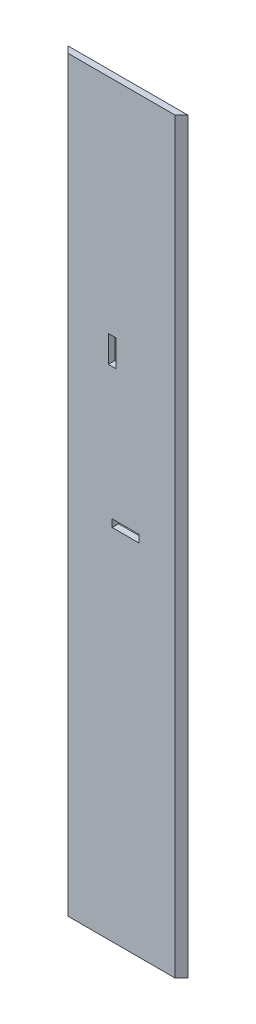
ISO-10303-21;
HEADER;
FILE_DESCRIPTION(('STEP AP214'),'2;1');
FILE_NAME('part.step','',(''),(''),'','','');
FILE_SCHEMA(('AUTOMOTIVE_DESIGN { 1 0 10303 214 1 1 1 1 }'));
ENDSEC;
DATA;
#1=APPLICATION_CONTEXT('core data for automotive mechanical design processes');
#2=APPLICATION_PROTOCOL_DEFINITION('international standard','automotive_design',2000,#1);
#3=PRODUCT_CONTEXT('',#1,'mechanical');
#4=PRODUCT('Part','Part','',(#3));
#5=PRODUCT_RELATED_PRODUCT_CATEGORY('part','',(#4));
#6=PRODUCT_DEFINITION_FORMATION('','',#4);
#7=PRODUCT_DEFINITION_CONTEXT('part definition',#1,'design');
#8=PRODUCT_DEFINITION('design','',#6,#7);
#9=PRODUCT_DEFINITION_SHAPE('','',#8);
#10=(LENGTH_UNIT() NAMED_UNIT(*) SI_UNIT(.MILLI.,.METRE.));
#11=(NAMED_UNIT(*) PLANE_ANGLE_UNIT() SI_UNIT($,.RADIAN.));
#12=(NAMED_UNIT(*) SI_UNIT($,.STERADIAN.) SOLID_ANGLE_UNIT());
#13=UNCERTAINTY_MEASURE_WITH_UNIT(LENGTH_MEASURE(1.E-05),#10,'distance_accuracy_value','');
#14=(GEOMETRIC_REPRESENTATION_CONTEXT(3) GLOBAL_UNCERTAINTY_ASSIGNED_CONTEXT((#13)) GLOBAL_UNIT_ASSIGNED_CONTEXT((#10,
#11,#12)) REPRESENTATION_CONTEXT('',''));
#15=CARTESIAN_POINT('',(0.,0.,0.));
#16=DIRECTION('',(0.,0.,1.));
#17=DIRECTION('',(1.,0.,0.));
#18=AXIS2_PLACEMENT_3D('',#15,#16,#17);
#19=CARTESIAN_POINT('',(25.,175.,3.00000000000006));
#20=DIRECTION('',(0.707106781186552,0.,0.707106781186543));
#21=DIRECTION('',(0.707106781186543,0.,-0.707106781186552));
#22=AXIS2_PLACEMENT_3D('',#19,#20,#21);
#23=PLANE('',#22);
#24=DIRECTION('',(-0.707106781186543,0.,0.707106781186552));
#25=VECTOR('',#24,1.);
#26=CARTESIAN_POINT('',(25.,-175.,3.00000000000006));
#27=LINE('',#26,#25);
#28=CARTESIAN_POINT('',(28.,-175.,0.));
#29=VERTEX_POINT('',#28);
#30=CARTESIAN_POINT('',(25.,-175.,3.));
#31=VERTEX_POINT('',#30);
#32=EDGE_CURVE('E234',#29,#31,#27,.T.);
#33=ORIENTED_EDGE('',*,*,#32,.F.);
#34=DIRECTION('',(0.,-1.,0.));
#35=VECTOR('',#34,1.);
#36=CARTESIAN_POINT('',(28.,175.,0.));
#37=LINE('',#36,#35);
#38=CARTESIAN_POINT('',(28.,175.,0.));
#39=VERTEX_POINT('',#38);
#40=EDGE_CURVE('E215',#39,#29,#37,.T.);
#41=ORIENTED_EDGE('',*,*,#40,.F.);
#42=DIRECTION('',(-0.707106781186543,0.,0.707106781186552));
#43=VECTOR('',#42,1.);
#44=CARTESIAN_POINT('',(25.,175.,3.00000000000006));
#45=LINE('',#44,#43);
#46=CARTESIAN_POINT('',(25.,175.,3.));
#47=VERTEX_POINT('',#46);
#48=EDGE_CURVE('E242',#39,#47,#45,.T.);
#49=ORIENTED_EDGE('',*,*,#48,.T.);
#50=DIRECTION('',(0.,1.,0.));
#51=VECTOR('',#50,1.);
#52=CARTESIAN_POINT('',(25.,-175.,3.));
#53=LINE('',#52,#51);
#54=EDGE_CURVE('E12',#31,#47,#53,.T.);
#55=ORIENTED_EDGE('',*,*,#54,.F.);
#56=EDGE_LOOP('',(#33,#41,#49,#55));
#57=FACE_BOUND('',#56,.T.);
#58=ADVANCED_FACE('F46',(#57),#23,.T.);
#59=CARTESIAN_POINT('',(25.,175.,3.));
#60=DIRECTION('',(0.,-1.,0.));
#61=DIRECTION('',(0.,0.,-1.));
#62=AXIS2_PLACEMENT_3D('',#59,#60,#61);
#63=PLANE('',#62);
#64=DIRECTION('',(-1.,0.,0.));
#65=VECTOR('',#64,1.);
#66=CARTESIAN_POINT('',(25.,175.,0.));
#67=LINE('',#66,#65);
#68=CARTESIAN_POINT('',(-28.,175.,0.));
#69=VERTEX_POINT('',#68);
#70=EDGE_CURVE('E238',#39,#69,#67,.T.);
#71=ORIENTED_EDGE('',*,*,#70,.T.);
#72=DIRECTION('',(-0.707106781186541,0.,-0.707106781186554));
#73=VECTOR('',#72,1.);
#74=CARTESIAN_POINT('',(-25.,175.,3.));
#75=LINE('',#74,#73);
#76=CARTESIAN_POINT('',(-25.,175.,3.));
#77=VERTEX_POINT('',#76);
#78=EDGE_CURVE('E225',#77,#69,#75,.T.);
#79=ORIENTED_EDGE('',*,*,#78,.F.);
#80=DIRECTION('',(-1.,0.,0.));
#81=VECTOR('',#80,1.);
#82=CARTESIAN_POINT('',(25.,175.,3.));
#83=LINE('',#82,#81);
#84=EDGE_CURVE('E249',#47,#77,#83,.T.);
#85=ORIENTED_EDGE('',*,*,#84,.F.);
#86=ORIENTED_EDGE('',*,*,#48,.F.);
#87=EDGE_LOOP('',(#71,#79,#85,#86));
#88=FACE_BOUND('',#87,.T.);
#89=ADVANCED_FACE('F48',(#88),#63,.F.);
#90=CARTESIAN_POINT('',(25.,-175.,3.));
#91=DIRECTION('',(0.,1.,0.));
#92=DIRECTION('',(0.,0.,1.));
#93=AXIS2_PLACEMENT_3D('',#90,#91,#92);
#94=PLANE('',#93);
#95=DIRECTION('',(1.,0.,0.));
#96=VECTOR('',#95,1.);
#97=CARTESIAN_POINT('',(25.,-175.,0.));
#98=LINE('',#97,#96);
#99=CARTESIAN_POINT('',(-28.,-175.,0.));
#100=VERTEX_POINT('',#99);
#101=EDGE_CURVE('E50',#100,#29,#98,.T.);
#102=ORIENTED_EDGE('',*,*,#101,.T.);
#103=ORIENTED_EDGE('',*,*,#32,.T.);
#104=DIRECTION('',(1.,0.,0.));
#105=VECTOR('',#104,1.);
#106=CARTESIAN_POINT('',(25.,-175.,3.));
#107=LINE('',#106,#105);
#108=CARTESIAN_POINT('',(-25.,-175.,3.));
#109=VERTEX_POINT('',#108);
#110=EDGE_CURVE('E56',#109,#31,#107,.T.);
#111=ORIENTED_EDGE('',*,*,#110,.F.);
#112=DIRECTION('',(-0.707106781186541,0.,-0.707106781186554));
#113=VECTOR('',#112,1.);
#114=CARTESIAN_POINT('',(-25.,-175.,3.));
#115=LINE('',#114,#113);
#116=EDGE_CURVE('E230',#109,#100,#115,.T.);
#117=ORIENTED_EDGE('',*,*,#116,.T.);
#118=EDGE_LOOP('',(#102,#103,#111,#117));
#119=FACE_BOUND('',#118,.T.);
#120=ADVANCED_FACE('F263',(#119),#94,.F.);
#121=CARTESIAN_POINT('',(0.,0.,3.));
#122=DIRECTION('',(0.,0.,-1.));
#123=DIRECTION('',(-1.,0.,0.));
#124=AXIS2_PLACEMENT_3D('',#121,#122,#123);
#125=PLANE('',#124);
#126=DIRECTION('',(0.,1.,0.));
#127=VECTOR('',#126,1.);
#128=CARTESIAN_POINT('',(-6.19075959069311,70.8073765712002,3.00000000000006));
#129=LINE('',#128,#127);
#130=CARTESIAN_POINT('',(-6.19075959069311,58.3073765712002,3.00000000000006));
#131=VERTEX_POINT('',#130);
#132=CARTESIAN_POINT('',(-6.19075959069311,70.8073765712002,3.00000000000006));
#133=VERTEX_POINT('',#132);
#134=EDGE_CURVE('E174',#131,#133,#129,.T.);
#135=ORIENTED_EDGE('',*,*,#134,.T.);
#136=DIRECTION('',(1.,0.,0.));
#137=VECTOR('',#136,1.);
#138=CARTESIAN_POINT('',(-6.19075959069311,70.8073765712002,3.00000000000006));
#139=LINE('',#138,#137);
#140=CARTESIAN_POINT('',(-2.69075959069311,70.8073765712002,3.00000000000006));
#141=VERTEX_POINT('',#140);
#142=EDGE_CURVE('E143',#133,#141,#139,.T.);
#143=ORIENTED_EDGE('',*,*,#142,.T.);
#144=DIRECTION('',(0.,-1.,0.));
#145=VECTOR('',#144,1.);
#146=CARTESIAN_POINT('',(-2.69075959069311,70.8073765712002,3.00000000000006));
#147=LINE('',#146,#145);
#148=CARTESIAN_POINT('',(-2.69075959069311,58.3073765712002,3.));
#149=VERTEX_POINT('',#148);
#150=EDGE_CURVE('E180',#141,#149,#147,.T.);
#151=ORIENTED_EDGE('',*,*,#150,.T.);
#152=DIRECTION('',(-1.,0.,0.));
#153=VECTOR('',#152,1.);
#154=CARTESIAN_POINT('',(-6.19075959069311,58.3073765712002,3.00000000000006));
#155=LINE('',#154,#153);
#156=EDGE_CURVE('E64',#149,#131,#155,.T.);
#157=ORIENTED_EDGE('',*,*,#156,.T.);
#158=EDGE_LOOP('',(#135,#143,#151,#157));
#159=FACE_BOUND('',#158,.T.);
#160=DIRECTION('',(-1.,0.,0.));
#161=VECTOR('',#160,1.);
#162=CARTESIAN_POINT('',(-4.46194433120131,-7.00000000000819,3.00000000000006));
#163=LINE('',#162,#161);
#164=CARTESIAN_POINT('',(8.03805566879869,-7.00000000000819,3.00000000000006));
#165=VERTEX_POINT('',#164);
#166=CARTESIAN_POINT('',(-4.46194433120131,-7.00000000000819,3.00000000000006));
#167=VERTEX_POINT('',#166);
#168=EDGE_CURVE('E197',#165,#167,#163,.T.);
#169=ORIENTED_EDGE('',*,*,#168,.T.);
#170=DIRECTION('',(0.,1.,0.));
#171=VECTOR('',#170,1.);
#172=CARTESIAN_POINT('',(-4.46194433120131,-3.50000000000819,3.00000000000006));
#173=LINE('',#172,#171);
#174=CARTESIAN_POINT('',(-4.46194433120131,-3.50000000000819,3.00000000000006));
#175=VERTEX_POINT('',#174);
#176=EDGE_CURVE('E186',#167,#175,#173,.T.);
#177=ORIENTED_EDGE('',*,*,#176,.T.);
#178=DIRECTION('',(1.,0.,0.));
#179=VECTOR('',#178,1.);
#180=CARTESIAN_POINT('',(-4.46194433120131,-3.50000000000819,3.00000000000006));
#181=LINE('',#180,#179);
#182=CARTESIAN_POINT('',(8.03805566879869,-3.50000000000819,3.));
#183=VERTEX_POINT('',#182);
#184=EDGE_CURVE('E190',#175,#183,#181,.T.);
#185=ORIENTED_EDGE('',*,*,#184,.T.);
#186=DIRECTION('',(0.,-1.,0.));
#187=VECTOR('',#186,1.);
#188=CARTESIAN_POINT('',(8.03805566879869,-3.50000000000819,3.00000000000006));
#189=LINE('',#188,#187);
#190=EDGE_CURVE('E72',#183,#165,#189,.T.);
#191=ORIENTED_EDGE('',*,*,#190,.T.);
#192=EDGE_LOOP('',(#169,#177,#185,#191));
#193=FACE_BOUND('',#192,.T.);
#194=ORIENTED_EDGE('',*,*,#84,.T.);
#195=DIRECTION('',(0.,-1.,0.));
#196=VECTOR('',#195,1.);
#197=CARTESIAN_POINT('',(-25.,-175.,3.));
#198=LINE('',#197,#196);
#199=EDGE_CURVE('E252',#77,#109,#198,.T.);
#200=ORIENTED_EDGE('',*,*,#199,.T.);
#201=ORIENTED_EDGE('',*,*,#110,.T.);
#202=ORIENTED_EDGE('',*,*,#54,.T.);
#203=EDGE_LOOP('',(#194,#200,#201,#202));
#204=FACE_BOUND('',#203,.T.);
#205=ADVANCED_FACE('F273',(#159,#193,#204),#125,.F.);
#206=CARTESIAN_POINT('',(0.,0.,0.));
#207=DIRECTION('',(0.,0.,-1.));
#208=DIRECTION('',(-1.,0.,0.));
#209=AXIS2_PLACEMENT_3D('',#206,#207,#208);
#210=PLANE('',#209);
#211=DIRECTION('',(1.,0.,0.));
#212=VECTOR('',#211,1.);
#213=CARTESIAN_POINT('',(-6.19075959069311,70.8073765712002,0.));
#214=LINE('',#213,#212);
#215=CARTESIAN_POINT('',(-6.19075959069311,70.8073765712002,0.));
#216=VERTEX_POINT('',#215);
#217=CARTESIAN_POINT('',(-2.69075959069311,70.8073765712002,0.));
#218=VERTEX_POINT('',#217);
#219=EDGE_CURVE('E140',#216,#218,#214,.T.);
#220=ORIENTED_EDGE('',*,*,#219,.F.);
#221=DIRECTION('',(0.,1.,0.));
#222=VECTOR('',#221,1.);
#223=CARTESIAN_POINT('',(-6.19075959069311,70.8073765712002,0.));
#224=LINE('',#223,#222);
#225=CARTESIAN_POINT('',(-6.19075959069311,58.3073765712002,0.));
#226=VERTEX_POINT('',#225);
#227=EDGE_CURVE('E151',#226,#216,#224,.T.);
#228=ORIENTED_EDGE('',*,*,#227,.F.);
#229=DIRECTION('',(-1.,0.,0.));
#230=VECTOR('',#229,1.);
#231=CARTESIAN_POINT('',(-6.19075959069311,58.3073765712002,0.));
#232=LINE('',#231,#230);
#233=CARTESIAN_POINT('',(-2.69075959069311,58.3073765712002,0.));
#234=VERTEX_POINT('',#233);
#235=EDGE_CURVE('E157',#234,#226,#232,.T.);
#236=ORIENTED_EDGE('',*,*,#235,.F.);
#237=DIRECTION('',(0.,-1.,0.));
#238=VECTOR('',#237,1.);
#239=CARTESIAN_POINT('',(-2.69075959069311,70.8073765712002,0.));
#240=LINE('',#239,#238);
#241=EDGE_CURVE('E163',#218,#234,#240,.T.);
#242=ORIENTED_EDGE('',*,*,#241,.F.);
#243=EDGE_LOOP('',(#220,#228,#236,#242));
#244=FACE_BOUND('',#243,.T.);
#245=DIRECTION('',(0.,1.,0.));
#246=VECTOR('',#245,1.);
#247=CARTESIAN_POINT('',(-4.46194433120131,-3.50000000000819,0.));
#248=LINE('',#247,#246);
#249=CARTESIAN_POINT('',(-4.46194433120131,-7.00000000000819,0.));
#250=VERTEX_POINT('',#249);
#251=CARTESIAN_POINT('',(-4.46194433120131,-3.50000000000819,0.));
#252=VERTEX_POINT('',#251);
#253=EDGE_CURVE('E165',#250,#252,#248,.T.);
#254=ORIENTED_EDGE('',*,*,#253,.F.);
#255=DIRECTION('',(-1.,0.,0.));
#256=VECTOR('',#255,1.);
#257=CARTESIAN_POINT('',(-4.46194433120131,-7.00000000000819,0.));
#258=LINE('',#257,#256);
#259=CARTESIAN_POINT('',(8.03805566879869,-7.00000000000819,0.));
#260=VERTEX_POINT('',#259);
#261=EDGE_CURVE('E191',#260,#250,#258,.T.);
#262=ORIENTED_EDGE('',*,*,#261,.F.);
#263=DIRECTION('',(0.,-1.,0.));
#264=VECTOR('',#263,1.);
#265=CARTESIAN_POINT('',(8.03805566879869,-3.50000000000819,0.));
#266=LINE('',#265,#264);
#267=CARTESIAN_POINT('',(8.03805566879869,-3.50000000000819,0.));
#268=VERTEX_POINT('',#267);
#269=EDGE_CURVE('E205',#268,#260,#266,.T.);
#270=ORIENTED_EDGE('',*,*,#269,.F.);
#271=DIRECTION('',(1.,0.,0.));
#272=VECTOR('',#271,1.);
#273=CARTESIAN_POINT('',(-4.46194433120131,-3.50000000000819,0.));
#274=LINE('',#273,#272);
#275=EDGE_CURVE('E169',#252,#268,#274,.T.);
#276=ORIENTED_EDGE('',*,*,#275,.F.);
#277=EDGE_LOOP('',(#254,#262,#270,#276));
#278=FACE_BOUND('',#277,.T.);
#279=ORIENTED_EDGE('',*,*,#70,.F.);
#280=ORIENTED_EDGE('',*,*,#40,.T.);
#281=ORIENTED_EDGE('',*,*,#101,.F.);
#282=DIRECTION('',(0.,-1.,0.));
#283=VECTOR('',#282,1.);
#284=CARTESIAN_POINT('',(-28.,175.,0.));
#285=LINE('',#284,#283);
#286=EDGE_CURVE('E229',#69,#100,#285,.T.);
#287=ORIENTED_EDGE('',*,*,#286,.F.);
#288=EDGE_LOOP('',(#279,#280,#281,#287));
#289=FACE_BOUND('',#288,.T.);
#290=ADVANCED_FACE('F160',(#244,#278,#289),#210,.T.);
#291=CARTESIAN_POINT('',(-25.,175.,3.));
#292=DIRECTION('',(-0.707106781186554,0.,0.707106781186541));
#293=DIRECTION('',(0.707106781186541,0.,0.707106781186554));
#294=AXIS2_PLACEMENT_3D('',#291,#292,#293);
#295=PLANE('',#294);
#296=ORIENTED_EDGE('',*,*,#116,.F.);
#297=ORIENTED_EDGE('',*,*,#199,.F.);
#298=ORIENTED_EDGE('',*,*,#78,.T.);
#299=ORIENTED_EDGE('',*,*,#286,.T.);
#300=EDGE_LOOP('',(#296,#297,#298,#299));
#301=FACE_BOUND('',#300,.T.);
#302=ADVANCED_FACE('F276',(#301),#295,.T.);
#303=CARTESIAN_POINT('',(-4.46194433120131,-3.50000000000819,3.00000000000006));
#304=DIRECTION('',(-1.,0.,0.));
#305=DIRECTION('',(0.,0.,1.));
#306=AXIS2_PLACEMENT_3D('',#303,#304,#305);
#307=PLANE('',#306);
#308=ORIENTED_EDGE('',*,*,#253,.T.);
#309=DIRECTION('',(0.,0.,-1.));
#310=VECTOR('',#309,1.);
#311=CARTESIAN_POINT('',(-4.46194433120131,-3.50000000000819,3.00000000000006));
#312=LINE('',#311,#310);
#313=EDGE_CURVE('E200',#175,#252,#312,.T.);
#314=ORIENTED_EDGE('',*,*,#313,.F.);
#315=ORIENTED_EDGE('',*,*,#176,.F.);
#316=DIRECTION('',(0.,0.,-1.));
#317=VECTOR('',#316,1.);
#318=CARTESIAN_POINT('',(-4.46194433120131,-7.00000000000819,3.00000000000006));
#319=LINE('',#318,#317);
#320=EDGE_CURVE('E212',#167,#250,#319,.T.);
#321=ORIENTED_EDGE('',*,*,#320,.T.);
#322=EDGE_LOOP('',(#308,#314,#315,#321));
#323=FACE_BOUND('',#322,.T.);
#324=ADVANCED_FACE('F278',(#323),#307,.F.);
#325=CARTESIAN_POINT('',(-4.46194433120131,-7.00000000000819,3.00000000000006));
#326=DIRECTION('',(0.,-1.,0.));
#327=DIRECTION('',(0.,0.,-1.));
#328=AXIS2_PLACEMENT_3D('',#325,#326,#327);
#329=PLANE('',#328);
#330=ORIENTED_EDGE('',*,*,#261,.T.);
#331=ORIENTED_EDGE('',*,*,#320,.F.);
#332=ORIENTED_EDGE('',*,*,#168,.F.);
#333=DIRECTION('',(0.,0.,-1.));
#334=VECTOR('',#333,1.);
#335=CARTESIAN_POINT('',(8.03805566879869,-7.00000000000819,3.00000000000006));
#336=LINE('',#335,#334);
#337=EDGE_CURVE('E216',#165,#260,#336,.T.);
#338=ORIENTED_EDGE('',*,*,#337,.T.);
#339=EDGE_LOOP('',(#330,#331,#332,#338));
#340=FACE_BOUND('',#339,.T.);
#341=ADVANCED_FACE('F285',(#340),#329,.F.);
#342=CARTESIAN_POINT('',(8.03805566879869,-3.50000000000819,3.00000000000006));
#343=DIRECTION('',(1.,0.,0.));
#344=DIRECTION('',(0.,1.,0.));
#345=AXIS2_PLACEMENT_3D('',#342,#343,#344);
#346=PLANE('',#345);
#347=ORIENTED_EDGE('',*,*,#269,.T.);
#348=ORIENTED_EDGE('',*,*,#337,.F.);
#349=ORIENTED_EDGE('',*,*,#190,.F.);
#350=DIRECTION('',(0.,0.,-1.));
#351=VECTOR('',#350,1.);
#352=CARTESIAN_POINT('',(8.03805566879869,-3.50000000000819,3.00000000000006));
#353=LINE('',#352,#351);
#354=EDGE_CURVE('E219',#183,#268,#353,.T.);
#355=ORIENTED_EDGE('',*,*,#354,.T.);
#356=EDGE_LOOP('',(#347,#348,#349,#355));
#357=FACE_BOUND('',#356,.T.);
#358=ADVANCED_FACE('F353',(#357),#346,.F.);
#359=CARTESIAN_POINT('',(-4.46194433120131,-3.50000000000819,3.00000000000006));
#360=DIRECTION('',(0.,1.,0.));
#361=DIRECTION('',(0.,0.,1.));
#362=AXIS2_PLACEMENT_3D('',#359,#360,#361);
#363=PLANE('',#362);
#364=ORIENTED_EDGE('',*,*,#275,.T.);
#365=ORIENTED_EDGE('',*,*,#354,.F.);
#366=ORIENTED_EDGE('',*,*,#184,.F.);
#367=ORIENTED_EDGE('',*,*,#313,.T.);
#368=EDGE_LOOP('',(#364,#365,#366,#367));
#369=FACE_BOUND('',#368,.T.);
#370=ADVANCED_FACE('F362',(#369),#363,.F.);
#371=CARTESIAN_POINT('',(-6.19075959069311,70.8073765712002,3.00000000000006));
#372=DIRECTION('',(0.,1.,0.));
#373=DIRECTION('',(0.,0.,1.));
#374=AXIS2_PLACEMENT_3D('',#371,#372,#373);
#375=PLANE('',#374);
#376=ORIENTED_EDGE('',*,*,#219,.T.);
#377=DIRECTION('',(0.,0.,-1.));
#378=VECTOR('',#377,1.);
#379=CARTESIAN_POINT('',(-2.69075959069311,70.8073765712002,3.00000000000006));
#380=LINE('',#379,#378);
#381=EDGE_CURVE('E177',#141,#218,#380,.T.);
#382=ORIENTED_EDGE('',*,*,#381,.F.);
#383=ORIENTED_EDGE('',*,*,#142,.F.);
#384=DIRECTION('',(0.,0.,-1.));
#385=VECTOR('',#384,1.);
#386=CARTESIAN_POINT('',(-6.19075959069311,70.8073765712002,3.00000000000006));
#387=LINE('',#386,#385);
#388=EDGE_CURVE('E136',#133,#216,#387,.T.);
#389=ORIENTED_EDGE('',*,*,#388,.T.);
#390=EDGE_LOOP('',(#376,#382,#383,#389));
#391=FACE_BOUND('',#390,.T.);
#392=ADVANCED_FACE('F138',(#391),#375,.F.);
#393=CARTESIAN_POINT('',(-6.19075959069311,70.8073765712002,3.00000000000006));
#394=DIRECTION('',(-1.,0.,0.));
#395=DIRECTION('',(0.,0.,1.));
#396=AXIS2_PLACEMENT_3D('',#393,#394,#395);
#397=PLANE('',#396);
#398=ORIENTED_EDGE('',*,*,#227,.T.);
#399=ORIENTED_EDGE('',*,*,#388,.F.);
#400=ORIENTED_EDGE('',*,*,#134,.F.);
#401=DIRECTION('',(0.,0.,-1.));
#402=VECTOR('',#401,1.);
#403=CARTESIAN_POINT('',(-6.19075959069311,58.3073765712002,3.00000000000006));
#404=LINE('',#403,#402);
#405=EDGE_CURVE('E148',#131,#226,#404,.T.);
#406=ORIENTED_EDGE('',*,*,#405,.T.);
#407=EDGE_LOOP('',(#398,#399,#400,#406));
#408=FACE_BOUND('',#407,.T.);
#409=ADVANCED_FACE('F152',(#408),#397,.F.);
#410=CARTESIAN_POINT('',(-6.19075959069311,58.3073765712002,3.00000000000006));
#411=DIRECTION('',(0.,-1.,0.));
#412=DIRECTION('',(0.,0.,-1.));
#413=AXIS2_PLACEMENT_3D('',#410,#411,#412);
#414=PLANE('',#413);
#415=ORIENTED_EDGE('',*,*,#235,.T.);
#416=ORIENTED_EDGE('',*,*,#405,.F.);
#417=ORIENTED_EDGE('',*,*,#156,.F.);
#418=DIRECTION('',(0.,0.,-1.));
#419=VECTOR('',#418,1.);
#420=CARTESIAN_POINT('',(-2.69075959069311,58.3073765712002,3.00000000000006));
#421=LINE('',#420,#419);
#422=EDGE_CURVE('E416',#149,#234,#421,.T.);
#423=ORIENTED_EDGE('',*,*,#422,.T.);
#424=EDGE_LOOP('',(#415,#416,#417,#423));
#425=FACE_BOUND('',#424,.T.);
#426=ADVANCED_FACE('F385',(#425),#414,.F.);
#427=CARTESIAN_POINT('',(-2.69075959069311,70.8073765712002,3.00000000000006));
#428=DIRECTION('',(1.,0.,0.));
#429=DIRECTION('',(0.,1.,0.));
#430=AXIS2_PLACEMENT_3D('',#427,#428,#429);
#431=PLANE('',#430);
#432=ORIENTED_EDGE('',*,*,#241,.T.);
#433=ORIENTED_EDGE('',*,*,#422,.F.);
#434=ORIENTED_EDGE('',*,*,#150,.F.);
#435=ORIENTED_EDGE('',*,*,#381,.T.);
#436=EDGE_LOOP('',(#432,#433,#434,#435));
#437=FACE_BOUND('',#436,.T.);
#438=ADVANCED_FACE('F393',(#437),#431,.F.);
#439=CLOSED_SHELL('',(#58,#89,#120,#205,#290,#302,#324,#341,#358,#370,#392,#409,#426,#438));
#440=MANIFOLD_SOLID_BREP('B2',#439);
#441=ADVANCED_BREP_SHAPE_REPRESENTATION('',(#18,#440),#14);
#442=SHAPE_DEFINITION_REPRESENTATION(#9,#441);
ENDSEC;
END-ISO-10303-21;
